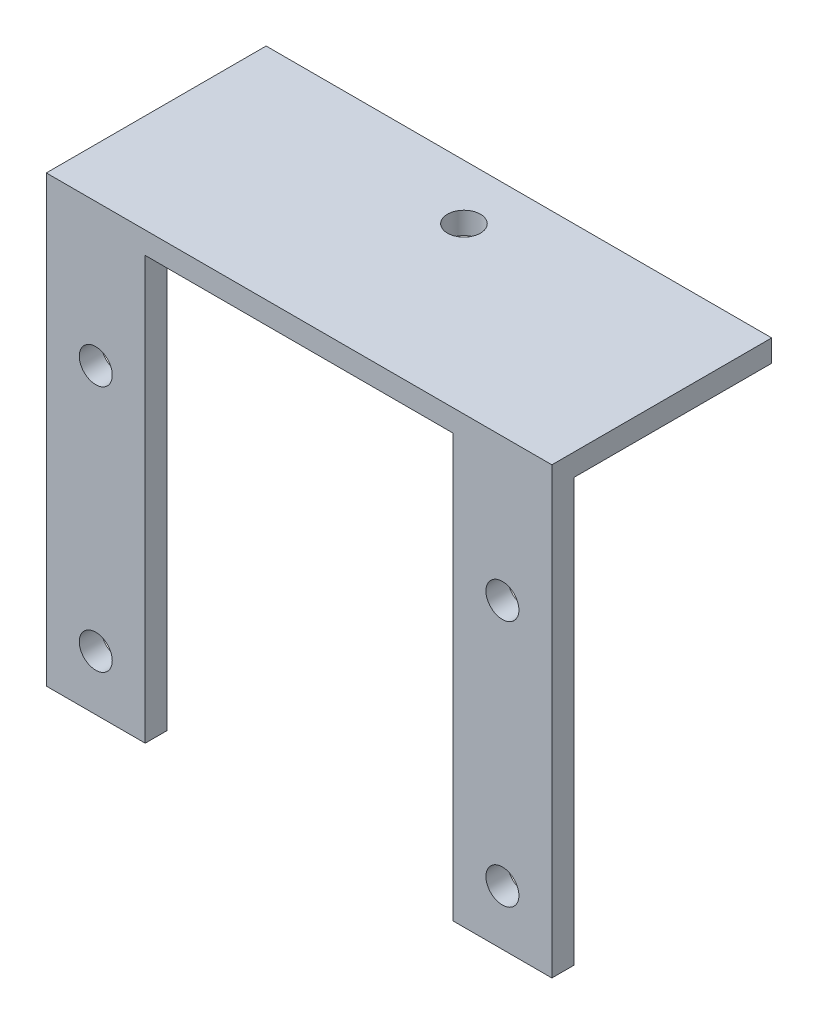
ISO-10303-21;
HEADER;
FILE_DESCRIPTION(('STEP AP214'),'2;1');
FILE_NAME('part.step','',(''),(''),'','','');
FILE_SCHEMA(('AUTOMOTIVE_DESIGN { 1 0 10303 214 1 1 1 1 }'));
ENDSEC;
DATA;
#1=APPLICATION_CONTEXT('core data for automotive mechanical design processes');
#2=APPLICATION_PROTOCOL_DEFINITION('international standard','automotive_design',2000,#1);
#3=PRODUCT_CONTEXT('',#1,'mechanical');
#4=PRODUCT('Part','Part','',(#3));
#5=PRODUCT_RELATED_PRODUCT_CATEGORY('part','',(#4));
#6=PRODUCT_DEFINITION_FORMATION('','',#4);
#7=PRODUCT_DEFINITION_CONTEXT('part definition',#1,'design');
#8=PRODUCT_DEFINITION('design','',#6,#7);
#9=PRODUCT_DEFINITION_SHAPE('','',#8);
#10=(LENGTH_UNIT() NAMED_UNIT(*) SI_UNIT(.MILLI.,.METRE.));
#11=(NAMED_UNIT(*) PLANE_ANGLE_UNIT() SI_UNIT($,.RADIAN.));
#12=(NAMED_UNIT(*) SI_UNIT($,.STERADIAN.) SOLID_ANGLE_UNIT());
#13=UNCERTAINTY_MEASURE_WITH_UNIT(LENGTH_MEASURE(1.E-05),#10,'distance_accuracy_value','');
#14=(GEOMETRIC_REPRESENTATION_CONTEXT(3) GLOBAL_UNCERTAINTY_ASSIGNED_CONTEXT((#13)) GLOBAL_UNIT_ASSIGNED_CONTEXT((#10,
#11,#12)) REPRESENTATION_CONTEXT('',''));
#15=CARTESIAN_POINT('',(0.,0.,0.));
#16=DIRECTION('',(0.,0.,1.));
#17=DIRECTION('',(1.,0.,0.));
#18=AXIS2_PLACEMENT_3D('',#15,#16,#17);
#19=CARTESIAN_POINT('',(0.,4.,0.));
#20=DIRECTION('',(0.,-1.,0.));
#21=DIRECTION('',(0.,0.,-1.));
#22=AXIS2_PLACEMENT_3D('',#19,#20,#21);
#23=PLANE('',#22);
#24=CARTESIAN_POINT('',(-2.51580828835598,4.,-13.));
#25=DIRECTION('',(0.,1.,0.));
#26=DIRECTION('',(0.,0.,1.));
#27=AXIS2_PLACEMENT_3D('',#24,#25,#26);
#28=CIRCLE('',#27,1.5);
#29=CARTESIAN_POINT('',(-2.51580828835598,4.,-11.5));
#30=VERTEX_POINT('',#29);
#31=EDGE_CURVE('E151',#30,#30,#28,.T.);
#32=ORIENTED_EDGE('',*,*,#31,.T.);
#33=EDGE_LOOP('',(#32));
#34=FACE_BOUND('',#33,.T.);
#35=DIRECTION('',(0.,0.,-1.));
#36=VECTOR('',#35,1.);
#37=CARTESIAN_POINT('',(20.484191711644,4.,2.));
#38=LINE('',#37,#36);
#39=CARTESIAN_POINT('',(20.484191711644,4.,0.));
#40=VERTEX_POINT('',#39);
#41=CARTESIAN_POINT('',(20.484191711644,4.,-18.));
#42=VERTEX_POINT('',#41);
#43=EDGE_CURVE('E131',#40,#42,#38,.T.);
#44=ORIENTED_EDGE('',*,*,#43,.F.);
#45=DIRECTION('',(-1.,0.,0.));
#46=VECTOR('',#45,1.);
#47=CARTESIAN_POINT('',(0.,4.,0.));
#48=LINE('',#47,#46);
#49=CARTESIAN_POINT('',(11.484191711644,4.,0.));
#50=VERTEX_POINT('',#49);
#51=EDGE_CURVE('E154',#40,#50,#48,.T.);
#52=ORIENTED_EDGE('',*,*,#51,.T.);
#53=DIRECTION('',(0.,0.,1.));
#54=VECTOR('',#53,1.);
#55=CARTESIAN_POINT('',(11.484191711644,4.,0.));
#56=LINE('',#55,#54);
#57=CARTESIAN_POINT('',(11.484191711644,4.,2.));
#58=VERTEX_POINT('',#57);
#59=EDGE_CURVE('E11',#50,#58,#56,.T.);
#60=ORIENTED_EDGE('',*,*,#59,.T.);
#61=DIRECTION('',(1.,0.,0.));
#62=VECTOR('',#61,1.);
#63=CARTESIAN_POINT('',(-25.515808288356,4.,2.));
#64=LINE('',#63,#62);
#65=CARTESIAN_POINT('',(-16.515808288356,4.,2.));
#66=VERTEX_POINT('',#65);
#67=EDGE_CURVE('E134',#66,#58,#64,.T.);
#68=ORIENTED_EDGE('',*,*,#67,.F.);
#69=DIRECTION('',(0.,0.,1.));
#70=VECTOR('',#69,1.);
#71=CARTESIAN_POINT('',(-16.515808288356,4.,2.));
#72=LINE('',#71,#70);
#73=CARTESIAN_POINT('',(-16.515808288356,4.,0.));
#74=VERTEX_POINT('',#73);
#75=EDGE_CURVE('E115',#74,#66,#72,.T.);
#76=ORIENTED_EDGE('',*,*,#75,.F.);
#77=DIRECTION('',(1.,0.,0.));
#78=VECTOR('',#77,1.);
#79=CARTESIAN_POINT('',(0.,4.,0.));
#80=LINE('',#79,#78);
#81=CARTESIAN_POINT('',(-25.515808288356,4.,0.));
#82=VERTEX_POINT('',#81);
#83=EDGE_CURVE('E94',#82,#74,#80,.T.);
#84=ORIENTED_EDGE('',*,*,#83,.F.);
#85=DIRECTION('',(0.,0.,1.));
#86=VECTOR('',#85,1.);
#87=CARTESIAN_POINT('',(-25.515808288356,4.,2.));
#88=LINE('',#87,#86);
#89=CARTESIAN_POINT('',(-25.515808288356,4.,-18.));
#90=VERTEX_POINT('',#89);
#91=EDGE_CURVE('E137',#90,#82,#88,.T.);
#92=ORIENTED_EDGE('',*,*,#91,.F.);
#93=DIRECTION('',(-1.,0.,0.));
#94=VECTOR('',#93,1.);
#95=CARTESIAN_POINT('',(-25.515808288356,4.,-18.));
#96=LINE('',#95,#94);
#97=EDGE_CURVE('E127',#42,#90,#96,.T.);
#98=ORIENTED_EDGE('',*,*,#97,.F.);
#99=EDGE_LOOP('',(#44,#52,#60,#68,#76,#84,#92,#98));
#100=FACE_BOUND('',#99,.T.);
#101=ADVANCED_FACE('F37',(#34,#100),#23,.T.);
#102=CARTESIAN_POINT('',(0.,0.,2.));
#103=DIRECTION('',(0.,0.,1.));
#104=DIRECTION('',(1.,0.,0.));
#105=AXIS2_PLACEMENT_3D('',#102,#103,#104);
#106=PLANE('',#105);
#107=DIRECTION('',(1.,0.,0.));
#108=VECTOR('',#107,1.);
#109=CARTESIAN_POINT('',(20.484191711644,-34.4383287652777,2.));
#110=LINE('',#109,#108);
#111=CARTESIAN_POINT('',(11.484191711644,-34.4383287652777,2.));
#112=VERTEX_POINT('',#111);
#113=CARTESIAN_POINT('',(20.484191711644,-34.4383287652777,2.));
#114=VERTEX_POINT('',#113);
#115=EDGE_CURVE('E165',#112,#114,#110,.T.);
#116=ORIENTED_EDGE('',*,*,#115,.T.);
#117=DIRECTION('',(0.,-1.,0.));
#118=VECTOR('',#117,1.);
#119=CARTESIAN_POINT('',(20.484191711644,6.,2.));
#120=LINE('',#119,#118);
#121=CARTESIAN_POINT('',(20.484191711644,6.,2.));
#122=VERTEX_POINT('',#121);
#123=EDGE_CURVE('E117',#122,#114,#120,.T.);
#124=ORIENTED_EDGE('',*,*,#123,.F.);
#125=DIRECTION('',(1.,0.,0.));
#126=VECTOR('',#125,1.);
#127=CARTESIAN_POINT('',(-25.515808288356,6.,2.));
#128=LINE('',#127,#126);
#129=CARTESIAN_POINT('',(-25.515808288356,6.,2.));
#130=VERTEX_POINT('',#129);
#131=EDGE_CURVE('E146',#130,#122,#128,.T.);
#132=ORIENTED_EDGE('',*,*,#131,.F.);
#133=DIRECTION('',(0.,-1.,0.));
#134=VECTOR('',#133,1.);
#135=CARTESIAN_POINT('',(-25.515808288356,-34.4383287652777,2.));
#136=LINE('',#135,#134);
#137=CARTESIAN_POINT('',(-25.515808288356,-34.4383287652777,2.));
#138=VERTEX_POINT('',#137);
#139=EDGE_CURVE('E103',#130,#138,#136,.T.);
#140=ORIENTED_EDGE('',*,*,#139,.T.);
#141=DIRECTION('',(1.,0.,0.));
#142=VECTOR('',#141,1.);
#143=CARTESIAN_POINT('',(-16.515808288356,-34.4383287652777,2.));
#144=LINE('',#143,#142);
#145=CARTESIAN_POINT('',(-16.515808288356,-34.4383287652777,2.));
#146=VERTEX_POINT('',#145);
#147=EDGE_CURVE('E60',#138,#146,#144,.T.);
#148=ORIENTED_EDGE('',*,*,#147,.T.);
#149=DIRECTION('',(0.,1.,0.));
#150=VECTOR('',#149,1.);
#151=CARTESIAN_POINT('',(-16.515808288356,-34.4383287652777,2.));
#152=LINE('',#151,#150);
#153=EDGE_CURVE('E82',#146,#66,#152,.T.);
#154=ORIENTED_EDGE('',*,*,#153,.T.);
#155=ORIENTED_EDGE('',*,*,#67,.T.);
#156=DIRECTION('',(0.,-1.,0.));
#157=VECTOR('',#156,1.);
#158=CARTESIAN_POINT('',(11.484191711644,-34.4383287652777,2.));
#159=LINE('',#158,#157);
#160=EDGE_CURVE('E52',#58,#112,#159,.T.);
#161=ORIENTED_EDGE('',*,*,#160,.T.);
#162=EDGE_LOOP('',(#116,#124,#132,#140,#148,#154,#155,#161));
#163=FACE_BOUND('',#162,.T.);
#164=CARTESIAN_POINT('',(15.984191711644,-29.4383287652777,2.));
#165=DIRECTION('',(0.,0.,1.));
#166=DIRECTION('',(1.,0.,0.));
#167=AXIS2_PLACEMENT_3D('',#164,#165,#166);
#168=CIRCLE('',#167,1.5);
#169=CARTESIAN_POINT('',(17.484191711644,-29.4383287652777,2.));
#170=VERTEX_POINT('',#169);
#171=EDGE_CURVE('E175',#170,#170,#168,.T.);
#172=ORIENTED_EDGE('',*,*,#171,.F.);
#173=EDGE_LOOP('',(#172));
#174=FACE_BOUND('',#173,.T.);
#175=CARTESIAN_POINT('',(15.984191711644,-6.93832876527765,2.));
#176=DIRECTION('',(0.,0.,1.));
#177=DIRECTION('',(1.,0.,0.));
#178=AXIS2_PLACEMENT_3D('',#175,#176,#177);
#179=CIRCLE('',#178,1.5);
#180=CARTESIAN_POINT('',(17.484191711644,-6.93832876527765,2.));
#181=VERTEX_POINT('',#180);
#182=EDGE_CURVE('E182',#181,#181,#179,.T.);
#183=ORIENTED_EDGE('',*,*,#182,.F.);
#184=EDGE_LOOP('',(#183));
#185=FACE_BOUND('',#184,.T.);
#186=CARTESIAN_POINT('',(-21.015808288356,-29.4383287652777,2.));
#187=DIRECTION('',(0.,0.,1.));
#188=DIRECTION('',(1.,0.,0.));
#189=AXIS2_PLACEMENT_3D('',#186,#187,#188);
#190=CIRCLE('',#189,1.5);
#191=CARTESIAN_POINT('',(-19.515808288356,-29.4383287652777,2.));
#192=VERTEX_POINT('',#191);
#193=EDGE_CURVE('E95',#192,#192,#190,.T.);
#194=ORIENTED_EDGE('',*,*,#193,.F.);
#195=EDGE_LOOP('',(#194));
#196=FACE_BOUND('',#195,.T.);
#197=CARTESIAN_POINT('',(-21.015808288356,-6.93832876527765,2.));
#198=DIRECTION('',(0.,0.,1.));
#199=DIRECTION('',(1.,0.,0.));
#200=AXIS2_PLACEMENT_3D('',#197,#198,#199);
#201=CIRCLE('',#200,1.5);
#202=CARTESIAN_POINT('',(-19.515808288356,-6.93832876527765,2.));
#203=VERTEX_POINT('',#202);
#204=EDGE_CURVE('E107',#203,#203,#201,.T.);
#205=ORIENTED_EDGE('',*,*,#204,.F.);
#206=EDGE_LOOP('',(#205));
#207=FACE_BOUND('',#206,.T.);
#208=ADVANCED_FACE('F194',(#163,#174,#185,#196,#207),#106,.T.);
#209=CARTESIAN_POINT('',(0.,0.,0.));
#210=DIRECTION('',(0.,0.,1.));
#211=DIRECTION('',(1.,0.,0.));
#212=AXIS2_PLACEMENT_3D('',#209,#210,#211);
#213=PLANE('',#212);
#214=DIRECTION('',(0.,-1.,0.));
#215=VECTOR('',#214,1.);
#216=CARTESIAN_POINT('',(-25.515808288356,-34.4383287652777,0.));
#217=LINE('',#216,#215);
#218=CARTESIAN_POINT('',(-25.515808288356,-34.4383287652777,0.));
#219=VERTEX_POINT('',#218);
#220=EDGE_CURVE('E83',#82,#219,#217,.T.);
#221=ORIENTED_EDGE('',*,*,#220,.F.);
#222=ORIENTED_EDGE('',*,*,#83,.T.);
#223=DIRECTION('',(0.,1.,0.));
#224=VECTOR('',#223,1.);
#225=CARTESIAN_POINT('',(-16.515808288356,-34.4383287652777,0.));
#226=LINE('',#225,#224);
#227=CARTESIAN_POINT('',(-16.515808288356,-34.4383287652777,0.));
#228=VERTEX_POINT('',#227);
#229=EDGE_CURVE('E88',#228,#74,#226,.T.);
#230=ORIENTED_EDGE('',*,*,#229,.F.);
#231=DIRECTION('',(1.,0.,0.));
#232=VECTOR('',#231,1.);
#233=CARTESIAN_POINT('',(-16.515808288356,-34.4383287652777,0.));
#234=LINE('',#233,#232);
#235=EDGE_CURVE('E73',#219,#228,#234,.T.);
#236=ORIENTED_EDGE('',*,*,#235,.F.);
#237=EDGE_LOOP('',(#221,#222,#230,#236));
#238=FACE_BOUND('',#237,.T.);
#239=CARTESIAN_POINT('',(-21.015808288356,-29.4383287652777,0.));
#240=DIRECTION('',(0.,0.,1.));
#241=DIRECTION('',(1.,0.,0.));
#242=AXIS2_PLACEMENT_3D('',#239,#240,#241);
#243=CIRCLE('',#242,1.5);
#244=CARTESIAN_POINT('',(-19.515808288356,-29.4383287652777,0.));
#245=VERTEX_POINT('',#244);
#246=EDGE_CURVE('E99',#245,#245,#243,.T.);
#247=ORIENTED_EDGE('',*,*,#246,.T.);
#248=EDGE_LOOP('',(#247));
#249=FACE_BOUND('',#248,.T.);
#250=CARTESIAN_POINT('',(-21.015808288356,-6.93832876527765,0.));
#251=DIRECTION('',(0.,0.,1.));
#252=DIRECTION('',(1.,0.,0.));
#253=AXIS2_PLACEMENT_3D('',#250,#251,#252);
#254=CIRCLE('',#253,1.5);
#255=CARTESIAN_POINT('',(-19.515808288356,-6.93832876527765,0.));
#256=VERTEX_POINT('',#255);
#257=EDGE_CURVE('E109',#256,#256,#254,.T.);
#258=ORIENTED_EDGE('',*,*,#257,.T.);
#259=EDGE_LOOP('',(#258));
#260=FACE_BOUND('',#259,.T.);
#261=ADVANCED_FACE('F91',(#238,#249,#260),#213,.F.);
#262=CARTESIAN_POINT('',(-16.515808288356,-34.4383287652777,2.));
#263=DIRECTION('',(-1.,0.,0.));
#264=DIRECTION('',(0.,0.,1.));
#265=AXIS2_PLACEMENT_3D('',#262,#263,#264);
#266=PLANE('',#265);
#267=ORIENTED_EDGE('',*,*,#229,.T.);
#268=ORIENTED_EDGE('',*,*,#75,.T.);
#269=ORIENTED_EDGE('',*,*,#153,.F.);
#270=DIRECTION('',(0.,0.,-1.));
#271=VECTOR('',#270,1.);
#272=CARTESIAN_POINT('',(-16.515808288356,-34.4383287652777,2.));
#273=LINE('',#272,#271);
#274=EDGE_CURVE('E76',#146,#228,#273,.T.);
#275=ORIENTED_EDGE('',*,*,#274,.T.);
#276=EDGE_LOOP('',(#267,#268,#269,#275));
#277=FACE_BOUND('',#276,.T.);
#278=ADVANCED_FACE('F39',(#277),#266,.F.);
#279=CARTESIAN_POINT('',(-25.515808288356,-34.4383287652777,2.));
#280=DIRECTION('',(1.,0.,0.));
#281=DIRECTION('',(0.,0.,-1.));
#282=AXIS2_PLACEMENT_3D('',#279,#280,#281);
#283=PLANE('',#282);
#284=ORIENTED_EDGE('',*,*,#91,.T.);
#285=ORIENTED_EDGE('',*,*,#220,.T.);
#286=DIRECTION('',(0.,0.,-1.));
#287=VECTOR('',#286,1.);
#288=CARTESIAN_POINT('',(-25.515808288356,-34.4383287652777,2.));
#289=LINE('',#288,#287);
#290=EDGE_CURVE('E45',#138,#219,#289,.T.);
#291=ORIENTED_EDGE('',*,*,#290,.F.);
#292=ORIENTED_EDGE('',*,*,#139,.F.);
#293=DIRECTION('',(0.,0.,1.));
#294=VECTOR('',#293,1.);
#295=CARTESIAN_POINT('',(-25.515808288356,6.,2.));
#296=LINE('',#295,#294);
#297=CARTESIAN_POINT('',(-25.515808288356,6.,-18.));
#298=VERTEX_POINT('',#297);
#299=EDGE_CURVE('E130',#298,#130,#296,.T.);
#300=ORIENTED_EDGE('',*,*,#299,.F.);
#301=DIRECTION('',(0.,-1.,0.));
#302=VECTOR('',#301,1.);
#303=CARTESIAN_POINT('',(-25.515808288356,6.,-18.));
#304=LINE('',#303,#302);
#305=EDGE_CURVE('E123',#298,#90,#304,.T.);
#306=ORIENTED_EDGE('',*,*,#305,.T.);
#307=EDGE_LOOP('',(#284,#285,#291,#292,#300,#306));
#308=FACE_BOUND('',#307,.T.);
#309=ADVANCED_FACE('F215',(#308),#283,.F.);
#310=CARTESIAN_POINT('',(-16.515808288356,-34.4383287652777,2.));
#311=DIRECTION('',(0.,1.,0.));
#312=DIRECTION('',(0.,0.,1.));
#313=AXIS2_PLACEMENT_3D('',#310,#311,#312);
#314=PLANE('',#313);
#315=ORIENTED_EDGE('',*,*,#235,.T.);
#316=ORIENTED_EDGE('',*,*,#274,.F.);
#317=ORIENTED_EDGE('',*,*,#147,.F.);
#318=ORIENTED_EDGE('',*,*,#290,.T.);
#319=EDGE_LOOP('',(#315,#316,#317,#318));
#320=FACE_BOUND('',#319,.T.);
#321=ADVANCED_FACE('F75',(#320),#314,.F.);
#322=CARTESIAN_POINT('',(-21.015808288356,-29.4383287652777,2.));
#323=DIRECTION('',(0.,0.,-1.));
#324=DIRECTION('',(-1.,0.,0.));
#325=AXIS2_PLACEMENT_3D('',#322,#323,#324);
#326=CYLINDRICAL_SURFACE('',#325,1.5);
#327=ORIENTED_EDGE('',*,*,#193,.T.);
#328=EDGE_LOOP('',(#327));
#329=FACE_BOUND('',#328,.T.);
#330=ORIENTED_EDGE('',*,*,#246,.F.);
#331=EDGE_LOOP('',(#330));
#332=FACE_BOUND('',#331,.T.);
#333=ADVANCED_FACE('F206',(#329,#332),#326,.F.);
#334=CARTESIAN_POINT('',(-21.015808288356,-6.93832876527765,2.));
#335=DIRECTION('',(0.,0.,-1.));
#336=DIRECTION('',(-1.,0.,0.));
#337=AXIS2_PLACEMENT_3D('',#334,#335,#336);
#338=CYLINDRICAL_SURFACE('',#337,1.5);
#339=ORIENTED_EDGE('',*,*,#204,.T.);
#340=EDGE_LOOP('',(#339));
#341=FACE_BOUND('',#340,.T.);
#342=ORIENTED_EDGE('',*,*,#257,.F.);
#343=EDGE_LOOP('',(#342));
#344=FACE_BOUND('',#343,.T.);
#345=ADVANCED_FACE('F202',(#341,#344),#338,.F.);
#346=CARTESIAN_POINT('',(0.,6.,0.));
#347=DIRECTION('',(0.,-1.,0.));
#348=DIRECTION('',(0.,0.,-1.));
#349=AXIS2_PLACEMENT_3D('',#346,#347,#348);
#350=PLANE('',#349);
#351=ORIENTED_EDGE('',*,*,#299,.T.);
#352=ORIENTED_EDGE('',*,*,#131,.T.);
#353=DIRECTION('',(0.,0.,-1.));
#354=VECTOR('',#353,1.);
#355=CARTESIAN_POINT('',(20.484191711644,6.,2.));
#356=LINE('',#355,#354);
#357=CARTESIAN_POINT('',(20.484191711644,6.,-18.));
#358=VERTEX_POINT('',#357);
#359=EDGE_CURVE('E143',#122,#358,#356,.T.);
#360=ORIENTED_EDGE('',*,*,#359,.T.);
#361=DIRECTION('',(-1.,0.,0.));
#362=VECTOR('',#361,1.);
#363=CARTESIAN_POINT('',(-25.515808288356,6.,-18.));
#364=LINE('',#363,#362);
#365=EDGE_CURVE('E126',#358,#298,#364,.T.);
#366=ORIENTED_EDGE('',*,*,#365,.T.);
#367=EDGE_LOOP('',(#351,#352,#360,#366));
#368=FACE_BOUND('',#367,.T.);
#369=CARTESIAN_POINT('',(-2.51580828835598,6.,-13.));
#370=DIRECTION('',(0.,1.,0.));
#371=DIRECTION('',(0.,0.,1.));
#372=AXIS2_PLACEMENT_3D('',#369,#370,#371);
#373=CIRCLE('',#372,1.5);
#374=CARTESIAN_POINT('',(-2.51580828835598,6.,-11.5));
#375=VERTEX_POINT('',#374);
#376=EDGE_CURVE('E140',#375,#375,#373,.T.);
#377=ORIENTED_EDGE('',*,*,#376,.F.);
#378=EDGE_LOOP('',(#377));
#379=FACE_BOUND('',#378,.T.);
#380=ADVANCED_FACE('F205',(#368,#379),#350,.F.);
#381=CARTESIAN_POINT('',(20.484191711644,6.,2.));
#382=DIRECTION('',(-1.,0.,0.));
#383=DIRECTION('',(0.,0.,1.));
#384=AXIS2_PLACEMENT_3D('',#381,#382,#383);
#385=PLANE('',#384);
#386=ORIENTED_EDGE('',*,*,#123,.T.);
#387=DIRECTION('',(0.,0.,-1.));
#388=VECTOR('',#387,1.);
#389=CARTESIAN_POINT('',(20.484191711644,-34.4383287652777,2.));
#390=LINE('',#389,#388);
#391=CARTESIAN_POINT('',(20.484191711644,-34.4383287652777,0.));
#392=VERTEX_POINT('',#391);
#393=EDGE_CURVE('E162',#114,#392,#390,.T.);
#394=ORIENTED_EDGE('',*,*,#393,.T.);
#395=DIRECTION('',(0.,1.,0.));
#396=VECTOR('',#395,1.);
#397=CARTESIAN_POINT('',(20.484191711644,-34.4383287652777,0.));
#398=LINE('',#397,#396);
#399=EDGE_CURVE('E172',#392,#40,#398,.T.);
#400=ORIENTED_EDGE('',*,*,#399,.T.);
#401=ORIENTED_EDGE('',*,*,#43,.T.);
#402=DIRECTION('',(0.,-1.,0.));
#403=VECTOR('',#402,1.);
#404=CARTESIAN_POINT('',(20.484191711644,6.,-18.));
#405=LINE('',#404,#403);
#406=EDGE_CURVE('E120',#358,#42,#405,.T.);
#407=ORIENTED_EDGE('',*,*,#406,.F.);
#408=ORIENTED_EDGE('',*,*,#359,.F.);
#409=EDGE_LOOP('',(#386,#394,#400,#401,#407,#408));
#410=FACE_BOUND('',#409,.T.);
#411=ADVANCED_FACE('F230',(#410),#385,.F.);
#412=CARTESIAN_POINT('',(-25.515808288356,6.,-18.));
#413=DIRECTION('',(0.,0.,1.));
#414=DIRECTION('',(1.,0.,0.));
#415=AXIS2_PLACEMENT_3D('',#412,#413,#414);
#416=PLANE('',#415);
#417=ORIENTED_EDGE('',*,*,#97,.T.);
#418=ORIENTED_EDGE('',*,*,#305,.F.);
#419=ORIENTED_EDGE('',*,*,#365,.F.);
#420=ORIENTED_EDGE('',*,*,#406,.T.);
#421=EDGE_LOOP('',(#417,#418,#419,#420));
#422=FACE_BOUND('',#421,.T.);
#423=ADVANCED_FACE('F226',(#422),#416,.F.);
#424=CARTESIAN_POINT('',(-2.51580828835598,6.,-13.));
#425=DIRECTION('',(0.,-1.,0.));
#426=DIRECTION('',(0.,0.,-1.));
#427=AXIS2_PLACEMENT_3D('',#424,#425,#426);
#428=CYLINDRICAL_SURFACE('',#427,1.5);
#429=ORIENTED_EDGE('',*,*,#376,.T.);
#430=EDGE_LOOP('',(#429));
#431=FACE_BOUND('',#430,.T.);
#432=ORIENTED_EDGE('',*,*,#31,.F.);
#433=EDGE_LOOP('',(#432));
#434=FACE_BOUND('',#433,.T.);
#435=ADVANCED_FACE('F229',(#431,#434),#428,.F.);
#436=CARTESIAN_POINT('',(0.,0.,0.));
#437=DIRECTION('',(0.,0.,1.));
#438=DIRECTION('',(1.,0.,0.));
#439=AXIS2_PLACEMENT_3D('',#436,#437,#438);
#440=PLANE('',#439);
#441=ORIENTED_EDGE('',*,*,#51,.F.);
#442=ORIENTED_EDGE('',*,*,#399,.F.);
#443=DIRECTION('',(1.,0.,0.));
#444=VECTOR('',#443,1.);
#445=CARTESIAN_POINT('',(20.484191711644,-34.4383287652777,0.));
#446=LINE('',#445,#444);
#447=CARTESIAN_POINT('',(11.484191711644,-34.4383287652777,0.));
#448=VERTEX_POINT('',#447);
#449=EDGE_CURVE('E166',#448,#392,#446,.T.);
#450=ORIENTED_EDGE('',*,*,#449,.F.);
#451=DIRECTION('',(0.,-1.,0.));
#452=VECTOR('',#451,1.);
#453=CARTESIAN_POINT('',(11.484191711644,-34.4383287652777,0.));
#454=LINE('',#453,#452);
#455=EDGE_CURVE('E169',#50,#448,#454,.T.);
#456=ORIENTED_EDGE('',*,*,#455,.F.);
#457=EDGE_LOOP('',(#441,#442,#450,#456));
#458=FACE_BOUND('',#457,.T.);
#459=CARTESIAN_POINT('',(15.984191711644,-29.4383287652777,0.));
#460=DIRECTION('',(0.,0.,1.));
#461=DIRECTION('',(1.,0.,0.));
#462=AXIS2_PLACEMENT_3D('',#459,#460,#461);
#463=CIRCLE('',#462,1.5);
#464=CARTESIAN_POINT('',(17.484191711644,-29.4383287652777,0.));
#465=VERTEX_POINT('',#464);
#466=EDGE_CURVE('E179',#465,#465,#463,.T.);
#467=ORIENTED_EDGE('',*,*,#466,.T.);
#468=EDGE_LOOP('',(#467));
#469=FACE_BOUND('',#468,.T.);
#470=CARTESIAN_POINT('',(15.984191711644,-6.93832876527765,0.));
#471=DIRECTION('',(0.,0.,1.));
#472=DIRECTION('',(1.,0.,0.));
#473=AXIS2_PLACEMENT_3D('',#470,#471,#472);
#474=CIRCLE('',#473,1.5);
#475=CARTESIAN_POINT('',(17.484191711644,-6.93832876527765,0.));
#476=VERTEX_POINT('',#475);
#477=EDGE_CURVE('E185',#476,#476,#474,.T.);
#478=ORIENTED_EDGE('',*,*,#477,.T.);
#479=EDGE_LOOP('',(#478));
#480=FACE_BOUND('',#479,.T.);
#481=ADVANCED_FACE('F291',(#458,#469,#480),#440,.F.);
#482=CARTESIAN_POINT('',(11.484191711644,-34.4383287652777,2.));
#483=DIRECTION('',(1.,0.,0.));
#484=DIRECTION('',(0.,1.,0.));
#485=AXIS2_PLACEMENT_3D('',#482,#483,#484);
#486=PLANE('',#485);
#487=ORIENTED_EDGE('',*,*,#59,.F.);
#488=ORIENTED_EDGE('',*,*,#455,.T.);
#489=DIRECTION('',(0.,0.,-1.));
#490=VECTOR('',#489,1.);
#491=CARTESIAN_POINT('',(11.484191711644,-34.4383287652777,2.));
#492=LINE('',#491,#490);
#493=EDGE_CURVE('E159',#112,#448,#492,.T.);
#494=ORIENTED_EDGE('',*,*,#493,.F.);
#495=ORIENTED_EDGE('',*,*,#160,.F.);
#496=EDGE_LOOP('',(#487,#488,#494,#495));
#497=FACE_BOUND('',#496,.T.);
#498=ADVANCED_FACE('F278',(#497),#486,.F.);
#499=CARTESIAN_POINT('',(20.484191711644,-34.4383287652777,2.));
#500=DIRECTION('',(0.,1.,0.));
#501=DIRECTION('',(0.,0.,1.));
#502=AXIS2_PLACEMENT_3D('',#499,#500,#501);
#503=PLANE('',#502);
#504=ORIENTED_EDGE('',*,*,#449,.T.);
#505=ORIENTED_EDGE('',*,*,#393,.F.);
#506=ORIENTED_EDGE('',*,*,#115,.F.);
#507=ORIENTED_EDGE('',*,*,#493,.T.);
#508=EDGE_LOOP('',(#504,#505,#506,#507));
#509=FACE_BOUND('',#508,.T.);
#510=ADVANCED_FACE('F283',(#509),#503,.F.);
#511=CARTESIAN_POINT('',(15.984191711644,-29.4383287652777,2.));
#512=DIRECTION('',(0.,0.,-1.));
#513=DIRECTION('',(-1.,0.,0.));
#514=AXIS2_PLACEMENT_3D('',#511,#512,#513);
#515=CYLINDRICAL_SURFACE('',#514,1.5);
#516=ORIENTED_EDGE('',*,*,#171,.T.);
#517=EDGE_LOOP('',(#516));
#518=FACE_BOUND('',#517,.T.);
#519=ORIENTED_EDGE('',*,*,#466,.F.);
#520=EDGE_LOOP('',(#519));
#521=FACE_BOUND('',#520,.T.);
#522=ADVANCED_FACE('F317',(#518,#521),#515,.F.);
#523=CARTESIAN_POINT('',(15.984191711644,-6.93832876527765,2.));
#524=DIRECTION('',(0.,0.,-1.));
#525=DIRECTION('',(-1.,0.,0.));
#526=AXIS2_PLACEMENT_3D('',#523,#524,#525);
#527=CYLINDRICAL_SURFACE('',#526,1.5);
#528=ORIENTED_EDGE('',*,*,#182,.T.);
#529=EDGE_LOOP('',(#528));
#530=FACE_BOUND('',#529,.T.);
#531=ORIENTED_EDGE('',*,*,#477,.F.);
#532=EDGE_LOOP('',(#531));
#533=FACE_BOUND('',#532,.T.);
#534=ADVANCED_FACE('F191',(#530,#533),#527,.F.);
#535=CLOSED_SHELL('',(#101,#208,#261,#278,#309,#321,#333,#345,#380,#411,#423,#435,#481,#498,
#510,#522,#534));
#536=MANIFOLD_SOLID_BREP('B2',#535);
#537=ADVANCED_BREP_SHAPE_REPRESENTATION('',(#18,#536),#14);
#538=SHAPE_DEFINITION_REPRESENTATION(#9,#537);
ENDSEC;
END-ISO-10303-21;
